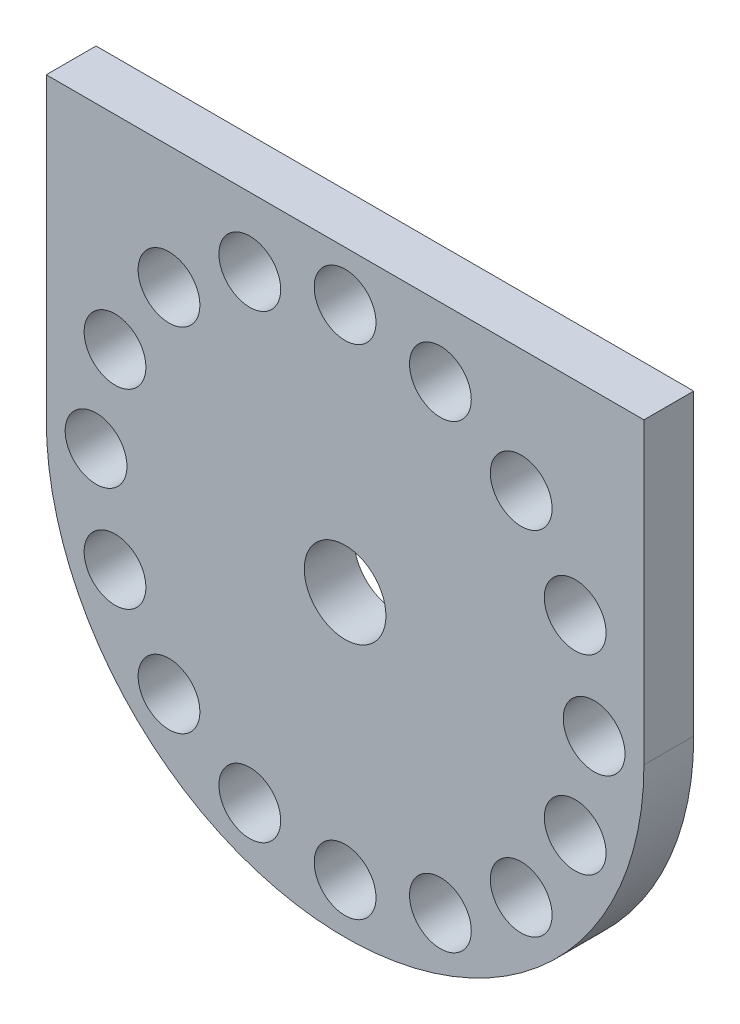
ISO-10303-21;
HEADER;
FILE_DESCRIPTION(('STEP AP214'),'2;1');
FILE_NAME('part.step','',(''),(''),'','','');
FILE_SCHEMA(('AUTOMOTIVE_DESIGN { 1 0 10303 214 1 1 1 1 }'));
ENDSEC;
DATA;
#1=APPLICATION_CONTEXT('core data for automotive mechanical design processes');
#2=APPLICATION_PROTOCOL_DEFINITION('international standard','automotive_design',2000,#1);
#3=PRODUCT_CONTEXT('',#1,'mechanical');
#4=PRODUCT('Part','Part','',(#3));
#5=PRODUCT_RELATED_PRODUCT_CATEGORY('part','',(#4));
#6=PRODUCT_DEFINITION_FORMATION('','',#4);
#7=PRODUCT_DEFINITION_CONTEXT('part definition',#1,'design');
#8=PRODUCT_DEFINITION('design','',#6,#7);
#9=PRODUCT_DEFINITION_SHAPE('','',#8);
#10=(LENGTH_UNIT() NAMED_UNIT(*) SI_UNIT(.MILLI.,.METRE.));
#11=(NAMED_UNIT(*) PLANE_ANGLE_UNIT() SI_UNIT($,.RADIAN.));
#12=(NAMED_UNIT(*) SI_UNIT($,.STERADIAN.) SOLID_ANGLE_UNIT());
#13=UNCERTAINTY_MEASURE_WITH_UNIT(LENGTH_MEASURE(1.E-05),#10,'distance_accuracy_value','');
#14=(GEOMETRIC_REPRESENTATION_CONTEXT(3) GLOBAL_UNCERTAINTY_ASSIGNED_CONTEXT((#13)) GLOBAL_UNIT_ASSIGNED_CONTEXT((#10,
#11,#12)) REPRESENTATION_CONTEXT('',''));
#15=CARTESIAN_POINT('',(0.,0.,0.));
#16=DIRECTION('',(0.,0.,1.));
#17=DIRECTION('',(1.,0.,0.));
#18=AXIS2_PLACEMENT_3D('',#15,#16,#17);
#19=CARTESIAN_POINT('',(0.,0.,5.));
#20=DIRECTION('',(0.,0.,-1.));
#21=DIRECTION('',(-1.,0.,0.));
#22=AXIS2_PLACEMENT_3D('',#19,#20,#21);
#23=CYLINDRICAL_SURFACE('',#22,30.);
#24=CARTESIAN_POINT('',(0.,0.,0.));
#25=DIRECTION('',(0.,0.,1.));
#26=DIRECTION('',(1.,0.,0.));
#27=AXIS2_PLACEMENT_3D('',#24,#25,#26);
#28=CIRCLE('',#27,30.);
#29=CARTESIAN_POINT('',(-30.,0.,0.));
#30=VERTEX_POINT('',#29);
#31=CARTESIAN_POINT('',(30.,0.,0.));
#32=VERTEX_POINT('',#31);
#33=EDGE_CURVE('E97',#30,#32,#28,.T.);
#34=ORIENTED_EDGE('',*,*,#33,.T.);
#35=DIRECTION('',(0.,0.,-1.));
#36=VECTOR('',#35,1.);
#37=CARTESIAN_POINT('',(30.,0.,5.));
#38=LINE('',#37,#36);
#39=CARTESIAN_POINT('',(30.,0.,5.));
#40=VERTEX_POINT('',#39);
#41=EDGE_CURVE('E11',#40,#32,#38,.T.);
#42=ORIENTED_EDGE('',*,*,#41,.F.);
#43=CARTESIAN_POINT('',(0.,0.,5.));
#44=DIRECTION('',(0.,0.,1.));
#45=DIRECTION('',(1.,0.,0.));
#46=AXIS2_PLACEMENT_3D('',#43,#44,#45);
#47=CIRCLE('',#46,30.);
#48=CARTESIAN_POINT('',(-30.,0.,5.));
#49=VERTEX_POINT('',#48);
#50=EDGE_CURVE('E85',#49,#40,#47,.T.);
#51=ORIENTED_EDGE('',*,*,#50,.F.);
#52=DIRECTION('',(0.,0.,-1.));
#53=VECTOR('',#52,1.);
#54=CARTESIAN_POINT('',(-30.,0.,5.));
#55=LINE('',#54,#53);
#56=EDGE_CURVE('E93',#49,#30,#55,.T.);
#57=ORIENTED_EDGE('',*,*,#56,.T.);
#58=EDGE_LOOP('',(#34,#42,#51,#57));
#59=FACE_BOUND('',#58,.T.);
#60=ADVANCED_FACE('F34',(#59),#23,.T.);
#61=CARTESIAN_POINT('',(30.,30.,5.));
#62=DIRECTION('',(-1.,0.,0.));
#63=DIRECTION('',(0.,0.,1.));
#64=AXIS2_PLACEMENT_3D('',#61,#62,#63);
#65=PLANE('',#64);
#66=DIRECTION('',(0.,1.,0.));
#67=VECTOR('',#66,1.);
#68=CARTESIAN_POINT('',(30.,30.,0.));
#69=LINE('',#68,#67);
#70=CARTESIAN_POINT('',(30.,30.,0.));
#71=VERTEX_POINT('',#70);
#72=EDGE_CURVE('E89',#32,#71,#69,.T.);
#73=ORIENTED_EDGE('',*,*,#72,.T.);
#74=DIRECTION('',(0.,0.,-1.));
#75=VECTOR('',#74,1.);
#76=CARTESIAN_POINT('',(30.,30.,5.));
#77=LINE('',#76,#75);
#78=CARTESIAN_POINT('',(30.,30.,5.));
#79=VERTEX_POINT('',#78);
#80=EDGE_CURVE('E42',#79,#71,#77,.T.);
#81=ORIENTED_EDGE('',*,*,#80,.F.);
#82=DIRECTION('',(0.,1.,0.));
#83=VECTOR('',#82,1.);
#84=CARTESIAN_POINT('',(30.,30.,5.));
#85=LINE('',#84,#83);
#86=EDGE_CURVE('E80',#40,#79,#85,.T.);
#87=ORIENTED_EDGE('',*,*,#86,.F.);
#88=ORIENTED_EDGE('',*,*,#41,.T.);
#89=EDGE_LOOP('',(#73,#81,#87,#88));
#90=FACE_BOUND('',#89,.T.);
#91=ADVANCED_FACE('F88',(#90),#65,.F.);
#92=CARTESIAN_POINT('',(-30.,30.,5.));
#93=DIRECTION('',(0.,-1.,0.));
#94=DIRECTION('',(0.,0.,-1.));
#95=AXIS2_PLACEMENT_3D('',#92,#93,#94);
#96=PLANE('',#95);
#97=DIRECTION('',(-1.,0.,0.));
#98=VECTOR('',#97,1.);
#99=CARTESIAN_POINT('',(-30.,30.,0.));
#100=LINE('',#99,#98);
#101=CARTESIAN_POINT('',(-30.,30.,0.));
#102=VERTEX_POINT('',#101);
#103=EDGE_CURVE('E67',#71,#102,#100,.T.);
#104=ORIENTED_EDGE('',*,*,#103,.T.);
#105=DIRECTION('',(0.,0.,-1.));
#106=VECTOR('',#105,1.);
#107=CARTESIAN_POINT('',(-30.,30.,5.));
#108=LINE('',#107,#106);
#109=CARTESIAN_POINT('',(-30.,30.,5.));
#110=VERTEX_POINT('',#109);
#111=EDGE_CURVE('E90',#110,#102,#108,.T.);
#112=ORIENTED_EDGE('',*,*,#111,.F.);
#113=DIRECTION('',(-1.,0.,0.));
#114=VECTOR('',#113,1.);
#115=CARTESIAN_POINT('',(-30.,30.,5.));
#116=LINE('',#115,#114);
#117=EDGE_CURVE('E83',#79,#110,#116,.T.);
#118=ORIENTED_EDGE('',*,*,#117,.F.);
#119=ORIENTED_EDGE('',*,*,#80,.T.);
#120=EDGE_LOOP('',(#104,#112,#118,#119));
#121=FACE_BOUND('',#120,.T.);
#122=ADVANCED_FACE('F91',(#121),#96,.F.);
#123=CARTESIAN_POINT('',(-30.,30.,5.));
#124=DIRECTION('',(1.,0.,0.));
#125=DIRECTION('',(0.,0.,-1.));
#126=AXIS2_PLACEMENT_3D('',#123,#124,#125);
#127=PLANE('',#126);
#128=DIRECTION('',(0.,-1.,0.));
#129=VECTOR('',#128,1.);
#130=CARTESIAN_POINT('',(-30.,30.,0.));
#131=LINE('',#130,#129);
#132=EDGE_CURVE('E73',#102,#30,#131,.T.);
#133=ORIENTED_EDGE('',*,*,#132,.T.);
#134=ORIENTED_EDGE('',*,*,#56,.F.);
#135=DIRECTION('',(0.,-1.,0.));
#136=VECTOR('',#135,1.);
#137=CARTESIAN_POINT('',(-30.,30.,5.));
#138=LINE('',#137,#136);
#139=EDGE_CURVE('E50',#110,#49,#138,.T.);
#140=ORIENTED_EDGE('',*,*,#139,.F.);
#141=ORIENTED_EDGE('',*,*,#111,.T.);
#142=EDGE_LOOP('',(#133,#134,#140,#141));
#143=FACE_BOUND('',#142,.T.);
#144=ADVANCED_FACE('F105',(#143),#127,.F.);
#145=CARTESIAN_POINT('',(0.,0.,5.));
#146=DIRECTION('',(0.,0.,1.));
#147=DIRECTION('',(1.,0.,0.));
#148=AXIS2_PLACEMENT_3D('',#145,#146,#147);
#149=PLANE('',#148);
#150=CARTESIAN_POINT('',(-9.56708580912693,23.0969883127823,5.));
#151=DIRECTION('',(0.,0.,1.));
#152=DIRECTION('',(1.,0.,0.));
#153=AXIS2_PLACEMENT_3D('',#150,#151,#152);
#154=CIRCLE('',#153,3.1);
#155=CARTESIAN_POINT('',(-6.46708580912693,23.0969883127823,5.));
#156=VERTEX_POINT('',#155);
#157=EDGE_CURVE('E207',#156,#156,#154,.T.);
#158=ORIENTED_EDGE('',*,*,#157,.F.);
#159=EDGE_LOOP('',(#158));
#160=FACE_BOUND('',#159,.T.);
#161=CARTESIAN_POINT('',(-17.6776695296634,17.6776695296629,5.));
#162=DIRECTION('',(0.,0.,1.));
#163=DIRECTION('',(1.,0.,0.));
#164=AXIS2_PLACEMENT_3D('',#161,#162,#163);
#165=CIRCLE('',#164,3.10000000000081);
#166=CARTESIAN_POINT('',(-14.5776695296626,17.6776695296629,5.));
#167=VERTEX_POINT('',#166);
#168=EDGE_CURVE('E201',#167,#167,#165,.T.);
#169=ORIENTED_EDGE('',*,*,#168,.F.);
#170=EDGE_LOOP('',(#169));
#171=FACE_BOUND('',#170,.T.);
#172=CARTESIAN_POINT('',(-23.0969883127815,9.56708580912627,5.));
#173=DIRECTION('',(0.,0.,1.));
#174=DIRECTION('',(1.,0.,0.));
#175=AXIS2_PLACEMENT_3D('',#172,#173,#174);
#176=CIRCLE('',#175,3.10000000000117);
#177=CARTESIAN_POINT('',(-19.9969883127803,9.56708580912627,5.));
#178=VERTEX_POINT('',#177);
#179=EDGE_CURVE('E195',#178,#178,#176,.T.);
#180=ORIENTED_EDGE('',*,*,#179,.F.);
#181=EDGE_LOOP('',(#180));
#182=FACE_BOUND('',#181,.T.);
#183=CARTESIAN_POINT('',(-24.9999999999989,-1.06581410364015E-12,5.));
#184=DIRECTION('',(0.,0.,1.));
#185=DIRECTION('',(1.,0.,0.));
#186=AXIS2_PLACEMENT_3D('',#183,#184,#185);
#187=CIRCLE('',#186,3.10000000000158);
#188=CARTESIAN_POINT('',(-21.8999999999974,-1.06581410364015E-12,5.));
#189=VERTEX_POINT('',#188);
#190=EDGE_CURVE('E189',#189,#189,#187,.T.);
#191=ORIENTED_EDGE('',*,*,#190,.F.);
#192=EDGE_LOOP('',(#191));
#193=FACE_BOUND('',#192,.T.);
#194=CARTESIAN_POINT('',(-23.0969883127807,-9.56708580912824,5.));
#195=DIRECTION('',(0.,0.,1.));
#196=DIRECTION('',(1.,0.,0.));
#197=AXIS2_PLACEMENT_3D('',#194,#195,#196);
#198=CIRCLE('',#197,3.10000000000195);
#199=CARTESIAN_POINT('',(-19.9969883127787,-9.56708580912824,5.));
#200=VERTEX_POINT('',#199);
#201=EDGE_CURVE('E183',#200,#200,#198,.T.);
#202=ORIENTED_EDGE('',*,*,#201,.F.);
#203=EDGE_LOOP('',(#202));
#204=FACE_BOUND('',#203,.T.);
#205=CARTESIAN_POINT('',(-17.6776695296619,-17.6776695296644,5.));
#206=DIRECTION('',(0.,0.,1.));
#207=DIRECTION('',(1.,0.,0.));
#208=AXIS2_PLACEMENT_3D('',#205,#206,#207);
#209=CIRCLE('',#208,3.10000000000216);
#210=CARTESIAN_POINT('',(-14.5776695296597,-17.6776695296644,5.));
#211=VERTEX_POINT('',#210);
#212=EDGE_CURVE('E177',#211,#211,#209,.T.);
#213=ORIENTED_EDGE('',*,*,#212,.F.);
#214=EDGE_LOOP('',(#213));
#215=FACE_BOUND('',#214,.T.);
#216=CARTESIAN_POINT('',(-9.5670858091252,-23.0969883127826,5.));
#217=DIRECTION('',(0.,0.,1.));
#218=DIRECTION('',(1.,0.,0.));
#219=AXIS2_PLACEMENT_3D('',#216,#217,#218);
#220=CIRCLE('',#219,3.10000000000227);
#221=CARTESIAN_POINT('',(-6.46708580912293,-23.0969883127826,5.));
#222=VERTEX_POINT('',#221);
#223=EDGE_CURVE('E171',#222,#222,#220,.T.);
#224=ORIENTED_EDGE('',*,*,#223,.F.);
#225=EDGE_LOOP('',(#224));
#226=FACE_BOUND('',#225,.T.);
#227=CARTESIAN_POINT('',(2.12550497328456E-12,-25.,5.));
#228=DIRECTION('',(0.,0.,1.));
#229=DIRECTION('',(1.,0.,0.));
#230=AXIS2_PLACEMENT_3D('',#227,#228,#229);
#231=CIRCLE('',#230,3.1000000000022);
#232=CARTESIAN_POINT('',(3.10000000000432,-25.,5.));
#233=VERTEX_POINT('',#232);
#234=EDGE_CURVE('E165',#233,#233,#231,.T.);
#235=ORIENTED_EDGE('',*,*,#234,.F.);
#236=EDGE_LOOP('',(#235));
#237=FACE_BOUND('',#236,.T.);
#238=CARTESIAN_POINT('',(9.56708580912929,-23.0969883127818,5.));
#239=DIRECTION('',(0.,0.,1.));
#240=DIRECTION('',(1.,0.,0.));
#241=AXIS2_PLACEMENT_3D('',#238,#239,#240);
#242=CIRCLE('',#241,3.10000000000198);
#243=CARTESIAN_POINT('',(12.6670858091313,-23.0969883127818,5.));
#244=VERTEX_POINT('',#243);
#245=EDGE_CURVE('E159',#244,#244,#242,.T.);
#246=ORIENTED_EDGE('',*,*,#245,.F.);
#247=EDGE_LOOP('',(#246));
#248=FACE_BOUND('',#247,.T.);
#249=CARTESIAN_POINT('',(17.6776695296655,-17.6776695296629,5.));
#250=DIRECTION('',(0.,0.,1.));
#251=DIRECTION('',(1.,0.,0.));
#252=AXIS2_PLACEMENT_3D('',#249,#250,#251);
#253=CIRCLE('',#252,3.10000000000164);
#254=CARTESIAN_POINT('',(20.7776695296671,-17.6776695296629,5.));
#255=VERTEX_POINT('',#254);
#256=EDGE_CURVE('E153',#255,#255,#253,.T.);
#257=ORIENTED_EDGE('',*,*,#256,.F.);
#258=EDGE_LOOP('',(#257));
#259=FACE_BOUND('',#258,.T.);
#260=CARTESIAN_POINT('',(23.0969883127836,-9.56708580912626,5.));
#261=DIRECTION('',(0.,0.,1.));
#262=DIRECTION('',(1.,0.,0.));
#263=AXIS2_PLACEMENT_3D('',#260,#261,#262);
#264=CIRCLE('',#263,3.10000000000122);
#265=CARTESIAN_POINT('',(26.1969883127849,-9.56708580912626,5.));
#266=VERTEX_POINT('',#265);
#267=EDGE_CURVE('E147',#266,#266,#264,.T.);
#268=ORIENTED_EDGE('',*,*,#267,.F.);
#269=EDGE_LOOP('',(#268));
#270=FACE_BOUND('',#269,.T.);
#271=CARTESIAN_POINT('',(25.0000000000011,1.06275248664228E-12,5.));
#272=DIRECTION('',(0.,0.,1.));
#273=DIRECTION('',(1.,0.,0.));
#274=AXIS2_PLACEMENT_3D('',#271,#272,#273);
#275=CIRCLE('',#274,3.10000000000079);
#276=CARTESIAN_POINT('',(28.1000000000019,1.06275248664228E-12,5.));
#277=VERTEX_POINT('',#276);
#278=EDGE_CURVE('E141',#277,#277,#275,.T.);
#279=ORIENTED_EDGE('',*,*,#278,.F.);
#280=EDGE_LOOP('',(#279));
#281=FACE_BOUND('',#280,.T.);
#282=CARTESIAN_POINT('',(23.0969883127828,9.56708580912823,5.));
#283=DIRECTION('',(0.,0.,1.));
#284=DIRECTION('',(1.,0.,0.));
#285=AXIS2_PLACEMENT_3D('',#282,#283,#284);
#286=CIRCLE('',#285,3.1000000000004);
#287=CARTESIAN_POINT('',(26.1969883127832,9.56708580912823,5.));
#288=VERTEX_POINT('',#287);
#289=EDGE_CURVE('E135',#288,#288,#286,.T.);
#290=ORIENTED_EDGE('',*,*,#289,.F.);
#291=EDGE_LOOP('',(#290));
#292=FACE_BOUND('',#291,.T.);
#293=CARTESIAN_POINT('',(17.677669529664,17.6776695296644,5.));
#294=DIRECTION('',(0.,0.,1.));
#295=DIRECTION('',(1.,0.,0.));
#296=AXIS2_PLACEMENT_3D('',#293,#294,#295);
#297=CIRCLE('',#296,3.10000000000012);
#298=CARTESIAN_POINT('',(20.7776695296641,17.6776695296644,5.));
#299=VERTEX_POINT('',#298);
#300=EDGE_CURVE('E129',#299,#299,#297,.T.);
#301=ORIENTED_EDGE('',*,*,#300,.F.);
#302=EDGE_LOOP('',(#301));
#303=FACE_BOUND('',#302,.T.);
#304=CARTESIAN_POINT('',(9.56708580912727,23.0969883127822,5.));
#305=DIRECTION('',(0.,0.,1.));
#306=DIRECTION('',(1.,0.,0.));
#307=AXIS2_PLACEMENT_3D('',#304,#305,#306);
#308=CIRCLE('',#307,3.1);
#309=CARTESIAN_POINT('',(12.6670858091273,23.0969883127822,5.));
#310=VERTEX_POINT('',#309);
#311=EDGE_CURVE('E123',#310,#310,#308,.T.);
#312=ORIENTED_EDGE('',*,*,#311,.F.);
#313=EDGE_LOOP('',(#312));
#314=FACE_BOUND('',#313,.T.);
#315=CARTESIAN_POINT('',(0.,25.,5.));
#316=DIRECTION('',(0.,0.,1.));
#317=DIRECTION('',(1.,0.,0.));
#318=AXIS2_PLACEMENT_3D('',#315,#316,#317);
#319=CIRCLE('',#318,3.1);
#320=CARTESIAN_POINT('',(3.1,25.,5.));
#321=VERTEX_POINT('',#320);
#322=EDGE_CURVE('E117',#321,#321,#319,.T.);
#323=ORIENTED_EDGE('',*,*,#322,.F.);
#324=EDGE_LOOP('',(#323));
#325=FACE_BOUND('',#324,.T.);
#326=CARTESIAN_POINT('',(0.,0.,5.));
#327=DIRECTION('',(0.,0.,1.));
#328=DIRECTION('',(1.,0.,0.));
#329=AXIS2_PLACEMENT_3D('',#326,#327,#328);
#330=CIRCLE('',#329,4.1);
#331=CARTESIAN_POINT('',(4.1,0.,5.));
#332=VERTEX_POINT('',#331);
#333=EDGE_CURVE('E111',#332,#332,#330,.T.);
#334=ORIENTED_EDGE('',*,*,#333,.F.);
#335=EDGE_LOOP('',(#334));
#336=FACE_BOUND('',#335,.T.);
#337=ORIENTED_EDGE('',*,*,#50,.T.);
#338=ORIENTED_EDGE('',*,*,#86,.T.);
#339=ORIENTED_EDGE('',*,*,#117,.T.);
#340=ORIENTED_EDGE('',*,*,#139,.T.);
#341=EDGE_LOOP('',(#337,#338,#339,#340));
#342=FACE_BOUND('',#341,.T.);
#343=ADVANCED_FACE('F81',(#160,#171,#182,#193,#204,#215,#226,#237,#248,#259,#270,#281,#292,#303,
#314,#325,#336,#342),#149,.T.);
#344=CARTESIAN_POINT('',(0.,0.,0.));
#345=DIRECTION('',(0.,0.,1.));
#346=DIRECTION('',(1.,0.,0.));
#347=AXIS2_PLACEMENT_3D('',#344,#345,#346);
#348=PLANE('',#347);
#349=CARTESIAN_POINT('',(-9.56708580912693,23.0969883127823,0.));
#350=DIRECTION('',(0.,0.,1.));
#351=DIRECTION('',(1.,0.,0.));
#352=AXIS2_PLACEMENT_3D('',#349,#350,#351);
#353=CIRCLE('',#352,3.1);
#354=CARTESIAN_POINT('',(-6.46708580912693,23.0969883127823,0.));
#355=VERTEX_POINT('',#354);
#356=EDGE_CURVE('E204',#355,#355,#353,.T.);
#357=ORIENTED_EDGE('',*,*,#356,.T.);
#358=EDGE_LOOP('',(#357));
#359=FACE_BOUND('',#358,.T.);
#360=CARTESIAN_POINT('',(-17.6776695296634,17.6776695296629,0.));
#361=DIRECTION('',(0.,0.,1.));
#362=DIRECTION('',(1.,0.,0.));
#363=AXIS2_PLACEMENT_3D('',#360,#361,#362);
#364=CIRCLE('',#363,3.10000000000081);
#365=CARTESIAN_POINT('',(-14.5776695296626,17.6776695296629,0.));
#366=VERTEX_POINT('',#365);
#367=EDGE_CURVE('E198',#366,#366,#364,.T.);
#368=ORIENTED_EDGE('',*,*,#367,.T.);
#369=EDGE_LOOP('',(#368));
#370=FACE_BOUND('',#369,.T.);
#371=CARTESIAN_POINT('',(-23.0969883127815,9.56708580912627,0.));
#372=DIRECTION('',(0.,0.,1.));
#373=DIRECTION('',(1.,0.,0.));
#374=AXIS2_PLACEMENT_3D('',#371,#372,#373);
#375=CIRCLE('',#374,3.10000000000117);
#376=CARTESIAN_POINT('',(-19.9969883127803,9.56708580912627,0.));
#377=VERTEX_POINT('',#376);
#378=EDGE_CURVE('E192',#377,#377,#375,.T.);
#379=ORIENTED_EDGE('',*,*,#378,.T.);
#380=EDGE_LOOP('',(#379));
#381=FACE_BOUND('',#380,.T.);
#382=CARTESIAN_POINT('',(-24.9999999999989,-1.06581410364015E-12,0.));
#383=DIRECTION('',(0.,0.,1.));
#384=DIRECTION('',(1.,0.,0.));
#385=AXIS2_PLACEMENT_3D('',#382,#383,#384);
#386=CIRCLE('',#385,3.10000000000158);
#387=CARTESIAN_POINT('',(-21.8999999999974,-1.06581410364015E-12,0.));
#388=VERTEX_POINT('',#387);
#389=EDGE_CURVE('E186',#388,#388,#386,.T.);
#390=ORIENTED_EDGE('',*,*,#389,.T.);
#391=EDGE_LOOP('',(#390));
#392=FACE_BOUND('',#391,.T.);
#393=CARTESIAN_POINT('',(-23.0969883127807,-9.56708580912824,0.));
#394=DIRECTION('',(0.,0.,1.));
#395=DIRECTION('',(1.,0.,0.));
#396=AXIS2_PLACEMENT_3D('',#393,#394,#395);
#397=CIRCLE('',#396,3.10000000000195);
#398=CARTESIAN_POINT('',(-19.9969883127787,-9.56708580912824,0.));
#399=VERTEX_POINT('',#398);
#400=EDGE_CURVE('E180',#399,#399,#397,.T.);
#401=ORIENTED_EDGE('',*,*,#400,.T.);
#402=EDGE_LOOP('',(#401));
#403=FACE_BOUND('',#402,.T.);
#404=CARTESIAN_POINT('',(-17.6776695296619,-17.6776695296644,0.));
#405=DIRECTION('',(0.,0.,1.));
#406=DIRECTION('',(1.,0.,0.));
#407=AXIS2_PLACEMENT_3D('',#404,#405,#406);
#408=CIRCLE('',#407,3.10000000000216);
#409=CARTESIAN_POINT('',(-14.5776695296597,-17.6776695296644,0.));
#410=VERTEX_POINT('',#409);
#411=EDGE_CURVE('E174',#410,#410,#408,.T.);
#412=ORIENTED_EDGE('',*,*,#411,.T.);
#413=EDGE_LOOP('',(#412));
#414=FACE_BOUND('',#413,.T.);
#415=CARTESIAN_POINT('',(-9.5670858091252,-23.0969883127826,0.));
#416=DIRECTION('',(0.,0.,1.));
#417=DIRECTION('',(1.,0.,0.));
#418=AXIS2_PLACEMENT_3D('',#415,#416,#417);
#419=CIRCLE('',#418,3.10000000000227);
#420=CARTESIAN_POINT('',(-6.46708580912293,-23.0969883127826,0.));
#421=VERTEX_POINT('',#420);
#422=EDGE_CURVE('E168',#421,#421,#419,.T.);
#423=ORIENTED_EDGE('',*,*,#422,.T.);
#424=EDGE_LOOP('',(#423));
#425=FACE_BOUND('',#424,.T.);
#426=CARTESIAN_POINT('',(2.12550497328456E-12,-25.,0.));
#427=DIRECTION('',(0.,0.,1.));
#428=DIRECTION('',(1.,0.,0.));
#429=AXIS2_PLACEMENT_3D('',#426,#427,#428);
#430=CIRCLE('',#429,3.1000000000022);
#431=CARTESIAN_POINT('',(3.10000000000432,-25.,0.));
#432=VERTEX_POINT('',#431);
#433=EDGE_CURVE('E162',#432,#432,#430,.T.);
#434=ORIENTED_EDGE('',*,*,#433,.T.);
#435=EDGE_LOOP('',(#434));
#436=FACE_BOUND('',#435,.T.);
#437=CARTESIAN_POINT('',(9.56708580912929,-23.0969883127818,0.));
#438=DIRECTION('',(0.,0.,1.));
#439=DIRECTION('',(1.,0.,0.));
#440=AXIS2_PLACEMENT_3D('',#437,#438,#439);
#441=CIRCLE('',#440,3.10000000000198);
#442=CARTESIAN_POINT('',(12.6670858091313,-23.0969883127818,0.));
#443=VERTEX_POINT('',#442);
#444=EDGE_CURVE('E156',#443,#443,#441,.T.);
#445=ORIENTED_EDGE('',*,*,#444,.T.);
#446=EDGE_LOOP('',(#445));
#447=FACE_BOUND('',#446,.T.);
#448=CARTESIAN_POINT('',(17.6776695296655,-17.6776695296629,0.));
#449=DIRECTION('',(0.,0.,1.));
#450=DIRECTION('',(1.,0.,0.));
#451=AXIS2_PLACEMENT_3D('',#448,#449,#450);
#452=CIRCLE('',#451,3.10000000000164);
#453=CARTESIAN_POINT('',(20.7776695296671,-17.6776695296629,0.));
#454=VERTEX_POINT('',#453);
#455=EDGE_CURVE('E150',#454,#454,#452,.T.);
#456=ORIENTED_EDGE('',*,*,#455,.T.);
#457=EDGE_LOOP('',(#456));
#458=FACE_BOUND('',#457,.T.);
#459=CARTESIAN_POINT('',(23.0969883127836,-9.56708580912626,0.));
#460=DIRECTION('',(0.,0.,1.));
#461=DIRECTION('',(1.,0.,0.));
#462=AXIS2_PLACEMENT_3D('',#459,#460,#461);
#463=CIRCLE('',#462,3.10000000000122);
#464=CARTESIAN_POINT('',(26.1969883127849,-9.56708580912626,0.));
#465=VERTEX_POINT('',#464);
#466=EDGE_CURVE('E144',#465,#465,#463,.T.);
#467=ORIENTED_EDGE('',*,*,#466,.T.);
#468=EDGE_LOOP('',(#467));
#469=FACE_BOUND('',#468,.T.);
#470=CARTESIAN_POINT('',(25.0000000000011,1.06275248664228E-12,0.));
#471=DIRECTION('',(0.,0.,1.));
#472=DIRECTION('',(1.,0.,0.));
#473=AXIS2_PLACEMENT_3D('',#470,#471,#472);
#474=CIRCLE('',#473,3.10000000000079);
#475=CARTESIAN_POINT('',(28.1000000000019,1.06275248664228E-12,0.));
#476=VERTEX_POINT('',#475);
#477=EDGE_CURVE('E138',#476,#476,#474,.T.);
#478=ORIENTED_EDGE('',*,*,#477,.T.);
#479=EDGE_LOOP('',(#478));
#480=FACE_BOUND('',#479,.T.);
#481=CARTESIAN_POINT('',(23.0969883127828,9.56708580912823,0.));
#482=DIRECTION('',(0.,0.,1.));
#483=DIRECTION('',(1.,0.,0.));
#484=AXIS2_PLACEMENT_3D('',#481,#482,#483);
#485=CIRCLE('',#484,3.1000000000004);
#486=CARTESIAN_POINT('',(26.1969883127832,9.56708580912823,0.));
#487=VERTEX_POINT('',#486);
#488=EDGE_CURVE('E132',#487,#487,#485,.T.);
#489=ORIENTED_EDGE('',*,*,#488,.T.);
#490=EDGE_LOOP('',(#489));
#491=FACE_BOUND('',#490,.T.);
#492=CARTESIAN_POINT('',(17.677669529664,17.6776695296644,0.));
#493=DIRECTION('',(0.,0.,1.));
#494=DIRECTION('',(1.,0.,0.));
#495=AXIS2_PLACEMENT_3D('',#492,#493,#494);
#496=CIRCLE('',#495,3.10000000000012);
#497=CARTESIAN_POINT('',(20.7776695296641,17.6776695296644,0.));
#498=VERTEX_POINT('',#497);
#499=EDGE_CURVE('E126',#498,#498,#496,.T.);
#500=ORIENTED_EDGE('',*,*,#499,.T.);
#501=EDGE_LOOP('',(#500));
#502=FACE_BOUND('',#501,.T.);
#503=CARTESIAN_POINT('',(9.56708580912727,23.0969883127822,0.));
#504=DIRECTION('',(0.,0.,1.));
#505=DIRECTION('',(1.,0.,0.));
#506=AXIS2_PLACEMENT_3D('',#503,#504,#505);
#507=CIRCLE('',#506,3.1);
#508=CARTESIAN_POINT('',(12.6670858091273,23.0969883127822,0.));
#509=VERTEX_POINT('',#508);
#510=EDGE_CURVE('E120',#509,#509,#507,.T.);
#511=ORIENTED_EDGE('',*,*,#510,.T.);
#512=EDGE_LOOP('',(#511));
#513=FACE_BOUND('',#512,.T.);
#514=CARTESIAN_POINT('',(0.,25.,0.));
#515=DIRECTION('',(0.,0.,1.));
#516=DIRECTION('',(1.,0.,0.));
#517=AXIS2_PLACEMENT_3D('',#514,#515,#516);
#518=CIRCLE('',#517,3.1);
#519=CARTESIAN_POINT('',(3.1,25.,0.));
#520=VERTEX_POINT('',#519);
#521=EDGE_CURVE('E114',#520,#520,#518,.T.);
#522=ORIENTED_EDGE('',*,*,#521,.T.);
#523=EDGE_LOOP('',(#522));
#524=FACE_BOUND('',#523,.T.);
#525=CARTESIAN_POINT('',(0.,0.,0.));
#526=DIRECTION('',(0.,0.,1.));
#527=DIRECTION('',(1.,0.,0.));
#528=AXIS2_PLACEMENT_3D('',#525,#526,#527);
#529=CIRCLE('',#528,4.1);
#530=CARTESIAN_POINT('',(4.1,0.,0.));
#531=VERTEX_POINT('',#530);
#532=EDGE_CURVE('E100',#531,#531,#529,.T.);
#533=ORIENTED_EDGE('',*,*,#532,.T.);
#534=EDGE_LOOP('',(#533));
#535=FACE_BOUND('',#534,.T.);
#536=ORIENTED_EDGE('',*,*,#33,.F.);
#537=ORIENTED_EDGE('',*,*,#132,.F.);
#538=ORIENTED_EDGE('',*,*,#103,.F.);
#539=ORIENTED_EDGE('',*,*,#72,.F.);
#540=EDGE_LOOP('',(#536,#537,#538,#539));
#541=FACE_BOUND('',#540,.T.);
#542=ADVANCED_FACE('F108',(#359,#370,#381,#392,#403,#414,#425,#436,#447,#458,#469,#480,#491,
#502,#513,#524,#535,#541),#348,.F.);
#543=CARTESIAN_POINT('',(0.,0.,0.));
#544=DIRECTION('',(0.,0.,1.));
#545=DIRECTION('',(1.,0.,0.));
#546=AXIS2_PLACEMENT_3D('',#543,#544,#545);
#547=CYLINDRICAL_SURFACE('',#546,4.1);
#548=ORIENTED_EDGE('',*,*,#532,.F.);
#549=EDGE_LOOP('',(#548));
#550=FACE_BOUND('',#549,.T.);
#551=ORIENTED_EDGE('',*,*,#333,.T.);
#552=EDGE_LOOP('',(#551));
#553=FACE_BOUND('',#552,.T.);
#554=ADVANCED_FACE('F257',(#550,#553),#547,.F.);
#555=CARTESIAN_POINT('',(0.,25.,0.));
#556=DIRECTION('',(0.,0.,1.));
#557=DIRECTION('',(1.,0.,0.));
#558=AXIS2_PLACEMENT_3D('',#555,#556,#557);
#559=CYLINDRICAL_SURFACE('',#558,3.1);
#560=ORIENTED_EDGE('',*,*,#521,.F.);
#561=EDGE_LOOP('',(#560));
#562=FACE_BOUND('',#561,.T.);
#563=ORIENTED_EDGE('',*,*,#322,.T.);
#564=EDGE_LOOP('',(#563));
#565=FACE_BOUND('',#564,.T.);
#566=ADVANCED_FACE('F259',(#562,#565),#559,.F.);
#567=CARTESIAN_POINT('',(9.56708580912727,23.0969883127822,0.));
#568=DIRECTION('',(0.,0.,1.));
#569=DIRECTION('',(1.,0.,0.));
#570=AXIS2_PLACEMENT_3D('',#567,#568,#569);
#571=CYLINDRICAL_SURFACE('',#570,3.1);
#572=ORIENTED_EDGE('',*,*,#510,.F.);
#573=EDGE_LOOP('',(#572));
#574=FACE_BOUND('',#573,.T.);
#575=ORIENTED_EDGE('',*,*,#311,.T.);
#576=EDGE_LOOP('',(#575));
#577=FACE_BOUND('',#576,.T.);
#578=ADVANCED_FACE('F266',(#574,#577),#571,.F.);
#579=CARTESIAN_POINT('',(17.677669529664,17.6776695296644,0.));
#580=DIRECTION('',(0.,0.,1.));
#581=DIRECTION('',(1.,0.,0.));
#582=AXIS2_PLACEMENT_3D('',#579,#580,#581);
#583=CYLINDRICAL_SURFACE('',#582,3.10000000000012);
#584=ORIENTED_EDGE('',*,*,#499,.F.);
#585=EDGE_LOOP('',(#584));
#586=FACE_BOUND('',#585,.T.);
#587=ORIENTED_EDGE('',*,*,#300,.T.);
#588=EDGE_LOOP('',(#587));
#589=FACE_BOUND('',#588,.T.);
#590=ADVANCED_FACE('F309',(#586,#589),#583,.F.);
#591=CARTESIAN_POINT('',(23.0969883127828,9.56708580912823,0.));
#592=DIRECTION('',(0.,0.,1.));
#593=DIRECTION('',(1.,0.,0.));
#594=AXIS2_PLACEMENT_3D('',#591,#592,#593);
#595=CYLINDRICAL_SURFACE('',#594,3.1000000000004);
#596=ORIENTED_EDGE('',*,*,#488,.F.);
#597=EDGE_LOOP('',(#596));
#598=FACE_BOUND('',#597,.T.);
#599=ORIENTED_EDGE('',*,*,#289,.T.);
#600=EDGE_LOOP('',(#599));
#601=FACE_BOUND('',#600,.T.);
#602=ADVANCED_FACE('F319',(#598,#601),#595,.F.);
#603=CARTESIAN_POINT('',(25.0000000000011,1.06275248664228E-12,0.));
#604=DIRECTION('',(0.,0.,1.));
#605=DIRECTION('',(1.,0.,0.));
#606=AXIS2_PLACEMENT_3D('',#603,#604,#605);
#607=CYLINDRICAL_SURFACE('',#606,3.10000000000079);
#608=ORIENTED_EDGE('',*,*,#477,.F.);
#609=EDGE_LOOP('',(#608));
#610=FACE_BOUND('',#609,.T.);
#611=ORIENTED_EDGE('',*,*,#278,.T.);
#612=EDGE_LOOP('',(#611));
#613=FACE_BOUND('',#612,.T.);
#614=ADVANCED_FACE('F329',(#610,#613),#607,.F.);
#615=CARTESIAN_POINT('',(23.0969883127836,-9.56708580912626,0.));
#616=DIRECTION('',(0.,0.,1.));
#617=DIRECTION('',(1.,0.,0.));
#618=AXIS2_PLACEMENT_3D('',#615,#616,#617);
#619=CYLINDRICAL_SURFACE('',#618,3.10000000000122);
#620=ORIENTED_EDGE('',*,*,#466,.F.);
#621=EDGE_LOOP('',(#620));
#622=FACE_BOUND('',#621,.T.);
#623=ORIENTED_EDGE('',*,*,#267,.T.);
#624=EDGE_LOOP('',(#623));
#625=FACE_BOUND('',#624,.T.);
#626=ADVANCED_FACE('F339',(#622,#625),#619,.F.);
#627=CARTESIAN_POINT('',(17.6776695296655,-17.6776695296629,0.));
#628=DIRECTION('',(0.,0.,1.));
#629=DIRECTION('',(1.,0.,0.));
#630=AXIS2_PLACEMENT_3D('',#627,#628,#629);
#631=CYLINDRICAL_SURFACE('',#630,3.10000000000164);
#632=ORIENTED_EDGE('',*,*,#455,.F.);
#633=EDGE_LOOP('',(#632));
#634=FACE_BOUND('',#633,.T.);
#635=ORIENTED_EDGE('',*,*,#256,.T.);
#636=EDGE_LOOP('',(#635));
#637=FACE_BOUND('',#636,.T.);
#638=ADVANCED_FACE('F349',(#634,#637),#631,.F.);
#639=CARTESIAN_POINT('',(9.56708580912929,-23.0969883127818,0.));
#640=DIRECTION('',(0.,0.,1.));
#641=DIRECTION('',(1.,0.,0.));
#642=AXIS2_PLACEMENT_3D('',#639,#640,#641);
#643=CYLINDRICAL_SURFACE('',#642,3.10000000000198);
#644=ORIENTED_EDGE('',*,*,#444,.F.);
#645=EDGE_LOOP('',(#644));
#646=FACE_BOUND('',#645,.T.);
#647=ORIENTED_EDGE('',*,*,#245,.T.);
#648=EDGE_LOOP('',(#647));
#649=FACE_BOUND('',#648,.T.);
#650=ADVANCED_FACE('F359',(#646,#649),#643,.F.);
#651=CARTESIAN_POINT('',(2.12550497328456E-12,-25.,0.));
#652=DIRECTION('',(0.,0.,1.));
#653=DIRECTION('',(1.,0.,0.));
#654=AXIS2_PLACEMENT_3D('',#651,#652,#653);
#655=CYLINDRICAL_SURFACE('',#654,3.1000000000022);
#656=ORIENTED_EDGE('',*,*,#433,.F.);
#657=EDGE_LOOP('',(#656));
#658=FACE_BOUND('',#657,.T.);
#659=ORIENTED_EDGE('',*,*,#234,.T.);
#660=EDGE_LOOP('',(#659));
#661=FACE_BOUND('',#660,.T.);
#662=ADVANCED_FACE('F369',(#658,#661),#655,.F.);
#663=CARTESIAN_POINT('',(-9.5670858091252,-23.0969883127826,0.));
#664=DIRECTION('',(0.,0.,1.));
#665=DIRECTION('',(1.,0.,0.));
#666=AXIS2_PLACEMENT_3D('',#663,#664,#665);
#667=CYLINDRICAL_SURFACE('',#666,3.10000000000227);
#668=ORIENTED_EDGE('',*,*,#422,.F.);
#669=EDGE_LOOP('',(#668));
#670=FACE_BOUND('',#669,.T.);
#671=ORIENTED_EDGE('',*,*,#223,.T.);
#672=EDGE_LOOP('',(#671));
#673=FACE_BOUND('',#672,.T.);
#674=ADVANCED_FACE('F379',(#670,#673),#667,.F.);
#675=CARTESIAN_POINT('',(-17.6776695296619,-17.6776695296644,0.));
#676=DIRECTION('',(0.,0.,1.));
#677=DIRECTION('',(1.,0.,0.));
#678=AXIS2_PLACEMENT_3D('',#675,#676,#677);
#679=CYLINDRICAL_SURFACE('',#678,3.10000000000216);
#680=ORIENTED_EDGE('',*,*,#411,.F.);
#681=EDGE_LOOP('',(#680));
#682=FACE_BOUND('',#681,.T.);
#683=ORIENTED_EDGE('',*,*,#212,.T.);
#684=EDGE_LOOP('',(#683));
#685=FACE_BOUND('',#684,.T.);
#686=ADVANCED_FACE('F389',(#682,#685),#679,.F.);
#687=CARTESIAN_POINT('',(-23.0969883127807,-9.56708580912824,0.));
#688=DIRECTION('',(0.,0.,1.));
#689=DIRECTION('',(1.,0.,0.));
#690=AXIS2_PLACEMENT_3D('',#687,#688,#689);
#691=CYLINDRICAL_SURFACE('',#690,3.10000000000195);
#692=ORIENTED_EDGE('',*,*,#400,.F.);
#693=EDGE_LOOP('',(#692));
#694=FACE_BOUND('',#693,.T.);
#695=ORIENTED_EDGE('',*,*,#201,.T.);
#696=EDGE_LOOP('',(#695));
#697=FACE_BOUND('',#696,.T.);
#698=ADVANCED_FACE('F399',(#694,#697),#691,.F.);
#699=CARTESIAN_POINT('',(-24.9999999999989,-1.06581410364015E-12,0.));
#700=DIRECTION('',(0.,0.,1.));
#701=DIRECTION('',(1.,0.,0.));
#702=AXIS2_PLACEMENT_3D('',#699,#700,#701);
#703=CYLINDRICAL_SURFACE('',#702,3.10000000000158);
#704=ORIENTED_EDGE('',*,*,#389,.F.);
#705=EDGE_LOOP('',(#704));
#706=FACE_BOUND('',#705,.T.);
#707=ORIENTED_EDGE('',*,*,#190,.T.);
#708=EDGE_LOOP('',(#707));
#709=FACE_BOUND('',#708,.T.);
#710=ADVANCED_FACE('F409',(#706,#709),#703,.F.);
#711=CARTESIAN_POINT('',(-23.0969883127815,9.56708580912627,0.));
#712=DIRECTION('',(0.,0.,1.));
#713=DIRECTION('',(1.,0.,0.));
#714=AXIS2_PLACEMENT_3D('',#711,#712,#713);
#715=CYLINDRICAL_SURFACE('',#714,3.10000000000117);
#716=ORIENTED_EDGE('',*,*,#378,.F.);
#717=EDGE_LOOP('',(#716));
#718=FACE_BOUND('',#717,.T.);
#719=ORIENTED_EDGE('',*,*,#179,.T.);
#720=EDGE_LOOP('',(#719));
#721=FACE_BOUND('',#720,.T.);
#722=ADVANCED_FACE('F419',(#718,#721),#715,.F.);
#723=CARTESIAN_POINT('',(-17.6776695296634,17.6776695296629,0.));
#724=DIRECTION('',(0.,0.,1.));
#725=DIRECTION('',(1.,0.,0.));
#726=AXIS2_PLACEMENT_3D('',#723,#724,#725);
#727=CYLINDRICAL_SURFACE('',#726,3.10000000000081);
#728=ORIENTED_EDGE('',*,*,#367,.F.);
#729=EDGE_LOOP('',(#728));
#730=FACE_BOUND('',#729,.T.);
#731=ORIENTED_EDGE('',*,*,#168,.T.);
#732=EDGE_LOOP('',(#731));
#733=FACE_BOUND('',#732,.T.);
#734=ADVANCED_FACE('F218',(#730,#733),#727,.F.);
#735=CARTESIAN_POINT('',(-9.56708580912693,23.0969883127823,0.));
#736=DIRECTION('',(0.,0.,1.));
#737=DIRECTION('',(1.,0.,0.));
#738=AXIS2_PLACEMENT_3D('',#735,#736,#737);
#739=CYLINDRICAL_SURFACE('',#738,3.1);
#740=ORIENTED_EDGE('',*,*,#356,.F.);
#741=EDGE_LOOP('',(#740));
#742=FACE_BOUND('',#741,.T.);
#743=ORIENTED_EDGE('',*,*,#157,.T.);
#744=EDGE_LOOP('',(#743));
#745=FACE_BOUND('',#744,.T.);
#746=ADVANCED_FACE('F215',(#742,#745),#739,.F.);
#747=CLOSED_SHELL('',(#60,#91,#122,#144,#343,#542,#554,#566,#578,#590,#602,#614,#626,#638,#650,
#662,#674,#686,#698,#710,#722,#734,#746));
#748=MANIFOLD_SOLID_BREP('B2',#747);
#749=ADVANCED_BREP_SHAPE_REPRESENTATION('',(#18,#748),#14);
#750=SHAPE_DEFINITION_REPRESENTATION(#9,#749);
ENDSEC;
END-ISO-10303-21;
